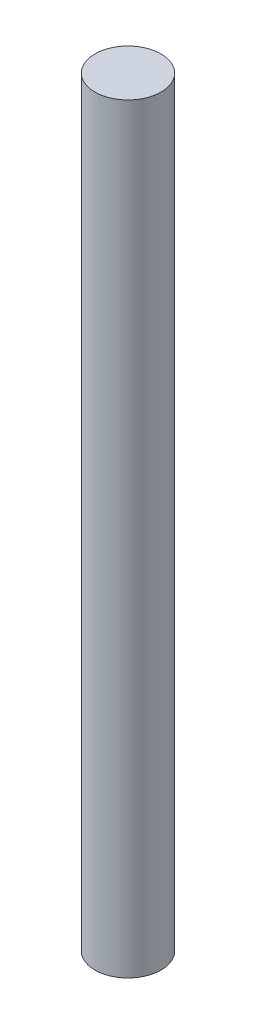
ISO-10303-21;
HEADER;
FILE_DESCRIPTION(('STEP AP214'),'2;1');
FILE_NAME('part.step','',(''),(''),'','','');
FILE_SCHEMA(('AUTOMOTIVE_DESIGN { 1 0 10303 214 1 1 1 1 }'));
ENDSEC;
DATA;
#1=APPLICATION_CONTEXT('core data for automotive mechanical design processes');
#2=APPLICATION_PROTOCOL_DEFINITION('international standard','automotive_design',2000,#1);
#3=PRODUCT_CONTEXT('',#1,'mechanical');
#4=PRODUCT('Part','Part','',(#3));
#5=PRODUCT_RELATED_PRODUCT_CATEGORY('part','',(#4));
#6=PRODUCT_DEFINITION_FORMATION('','',#4);
#7=PRODUCT_DEFINITION_CONTEXT('part definition',#1,'design');
#8=PRODUCT_DEFINITION('design','',#6,#7);
#9=PRODUCT_DEFINITION_SHAPE('','',#8);
#10=(LENGTH_UNIT() NAMED_UNIT(*) SI_UNIT(.MILLI.,.METRE.));
#11=(NAMED_UNIT(*) PLANE_ANGLE_UNIT() SI_UNIT($,.RADIAN.));
#12=(NAMED_UNIT(*) SI_UNIT($,.STERADIAN.) SOLID_ANGLE_UNIT());
#13=UNCERTAINTY_MEASURE_WITH_UNIT(LENGTH_MEASURE(1.E-05),#10,'distance_accuracy_value','');
#14=(GEOMETRIC_REPRESENTATION_CONTEXT(3) GLOBAL_UNCERTAINTY_ASSIGNED_CONTEXT((#13)) GLOBAL_UNIT_ASSIGNED_CONTEXT((#10,
#11,#12)) REPRESENTATION_CONTEXT('',''));
#15=CARTESIAN_POINT('',(0.,0.,0.));
#16=DIRECTION('',(0.,0.,1.));
#17=DIRECTION('',(1.,0.,0.));
#18=AXIS2_PLACEMENT_3D('',#15,#16,#17);
#19=CARTESIAN_POINT('',(37.7476914478386,-76.7316967124509,24.9730881922549));
#20=DIRECTION('',(0.,-1.,0.));
#21=DIRECTION('',(0.,0.,-1.));
#22=AXIS2_PLACEMENT_3D('',#19,#20,#21);
#23=PLANE('',#22);
#24=CARTESIAN_POINT('',(37.7476914478386,-76.7316967124509,24.9730881922549));
#25=DIRECTION('',(0.,-1.,0.));
#26=DIRECTION('',(0.,0.,-1.));
#27=AXIS2_PLACEMENT_3D('',#24,#25,#26);
#28=CIRCLE('',#27,2.);
#29=CARTESIAN_POINT('',(37.7476914478386,-76.7316967124509,26.9730881922549));
#30=VERTEX_POINT('',#29);
#31=EDGE_CURVE('E40',#30,#30,#28,.T.);
#32=ORIENTED_EDGE('',*,*,#31,.F.);
#33=EDGE_LOOP('',(#32));
#34=FACE_BOUND('',#33,.T.);
#35=ADVANCED_FACE('F33',(#34),#23,.F.);
#36=CARTESIAN_POINT('',(37.7476914478386,-128.388550961943,24.9730881922549));
#37=DIRECTION('',(0.,1.,0.));
#38=DIRECTION('',(0.,0.,1.));
#39=AXIS2_PLACEMENT_3D('',#36,#37,#38);
#40=CYLINDRICAL_SURFACE('',#39,2.);
#41=CARTESIAN_POINT('',(37.7476914478386,-122.731696712451,24.9730881922549));
#42=DIRECTION('',(0.,1.,0.));
#43=DIRECTION('',(0.,0.,1.));
#44=AXIS2_PLACEMENT_3D('',#41,#42,#43);
#45=CIRCLE('',#44,2.);
#46=CARTESIAN_POINT('',(37.7476914478386,-122.731696712451,26.9730881922549));
#47=VERTEX_POINT('',#46);
#48=EDGE_CURVE('E10',#47,#47,#45,.T.);
#49=CARTESIAN_POINT('',(37.7476914478386,-122.731696712451,26.9730881922549));
#50=CARTESIAN_POINT('',(37.7476914478386,-122.252530045784,26.9730881922549));
#51=CARTESIAN_POINT('',(37.7476914478386,-121.773363379118,26.9730881922549));
#52=CARTESIAN_POINT('',(37.7476914478386,-120.815030045784,26.9730881922549));
#53=CARTESIAN_POINT('',(37.7476914478386,-120.335863379118,26.9730881922549));
#54=CARTESIAN_POINT('',(37.7476914478386,-119.377530045784,26.9730881922549));
#55=CARTESIAN_POINT('',(37.7476914478386,-118.898363379118,26.9730881922549));
#56=CARTESIAN_POINT('',(37.7476914478386,-117.940030045784,26.9730881922549));
#57=CARTESIAN_POINT('',(37.7476914478386,-117.460863379118,26.9730881922549));
#58=CARTESIAN_POINT('',(37.7476914478386,-116.502530045784,26.9730881922549));
#59=CARTESIAN_POINT('',(37.7476914478386,-116.023363379118,26.9730881922549));
#60=CARTESIAN_POINT('',(37.7476914478386,-115.065030045784,26.9730881922549));
#61=CARTESIAN_POINT('',(37.7476914478386,-114.585863379118,26.9730881922549));
#62=CARTESIAN_POINT('',(37.7476914478386,-113.627530045784,26.9730881922549));
#63=CARTESIAN_POINT('',(37.7476914478386,-113.148363379118,26.9730881922549));
#64=CARTESIAN_POINT('',(37.7476914478386,-112.190030045784,26.9730881922549));
#65=CARTESIAN_POINT('',(37.7476914478386,-111.710863379118,26.9730881922549));
#66=CARTESIAN_POINT('',(37.7476914478386,-110.752530045784,26.9730881922549));
#67=CARTESIAN_POINT('',(37.7476914478386,-110.273363379118,26.9730881922549));
#68=CARTESIAN_POINT('',(37.7476914478386,-109.315030045784,26.9730881922549));
#69=CARTESIAN_POINT('',(37.7476914478386,-108.835863379118,26.9730881922549));
#70=CARTESIAN_POINT('',(37.7476914478386,-107.877530045784,26.9730881922549));
#71=CARTESIAN_POINT('',(37.7476914478386,-107.398363379118,26.9730881922549));
#72=CARTESIAN_POINT('',(37.7476914478386,-106.440030045784,26.9730881922549));
#73=CARTESIAN_POINT('',(37.7476914478386,-105.960863379118,26.9730881922549));
#74=CARTESIAN_POINT('',(37.7476914478386,-105.002530045784,26.9730881922549));
#75=CARTESIAN_POINT('',(37.7476914478386,-104.523363379118,26.9730881922549));
#76=CARTESIAN_POINT('',(37.7476914478386,-103.565030045784,26.9730881922549));
#77=CARTESIAN_POINT('',(37.7476914478386,-103.085863379118,26.9730881922549));
#78=CARTESIAN_POINT('',(37.7476914478386,-102.127530045784,26.9730881922549));
#79=CARTESIAN_POINT('',(37.7476914478386,-101.648363379118,26.9730881922549));
#80=CARTESIAN_POINT('',(37.7476914478386,-100.690030045784,26.9730881922549));
#81=CARTESIAN_POINT('',(37.7476914478386,-100.210863379118,26.9730881922549));
#82=CARTESIAN_POINT('',(37.7476914478386,-99.2525300457842,26.9730881922549));
#83=CARTESIAN_POINT('',(37.7476914478386,-98.7733633791176,26.9730881922549));
#84=CARTESIAN_POINT('',(37.7476914478386,-97.8150300457843,26.9730881922549));
#85=CARTESIAN_POINT('',(37.7476914478386,-97.3358633791176,26.9730881922549));
#86=CARTESIAN_POINT('',(37.7476914478386,-96.3775300457843,26.9730881922549));
#87=CARTESIAN_POINT('',(37.7476914478386,-95.8983633791176,26.9730881922549));
#88=CARTESIAN_POINT('',(37.7476914478386,-94.9400300457842,26.9730881922549));
#89=CARTESIAN_POINT('',(37.7476914478386,-94.4608633791176,26.9730881922549));
#90=CARTESIAN_POINT('',(37.7476914478386,-93.5025300457843,26.9730881922549));
#91=CARTESIAN_POINT('',(37.7476914478386,-93.0233633791176,26.9730881922549));
#92=CARTESIAN_POINT('',(37.7476914478386,-92.0650300457843,26.9730881922549));
#93=CARTESIAN_POINT('',(37.7476914478386,-91.5858633791176,26.9730881922549));
#94=CARTESIAN_POINT('',(37.7476914478386,-90.6275300457843,26.9730881922549));
#95=CARTESIAN_POINT('',(37.7476914478386,-90.1483633791176,26.9730881922549));
#96=CARTESIAN_POINT('',(37.7476914478386,-89.1900300457842,26.9730881922549));
#97=CARTESIAN_POINT('',(37.7476914478386,-88.7108633791176,26.9730881922549));
#98=CARTESIAN_POINT('',(37.7476914478386,-87.7525300457842,26.9730881922549));
#99=CARTESIAN_POINT('',(37.7476914478386,-87.2733633791176,26.9730881922549));
#100=CARTESIAN_POINT('',(37.7476914478386,-86.3150300457843,26.9730881922549));
#101=CARTESIAN_POINT('',(37.7476914478386,-85.8358633791176,26.9730881922549));
#102=CARTESIAN_POINT('',(37.7476914478386,-84.8775300457842,26.9730881922549));
#103=CARTESIAN_POINT('',(37.7476914478386,-84.3983633791176,26.9730881922549));
#104=CARTESIAN_POINT('',(37.7476914478386,-83.4400300457842,26.9730881922549));
#105=CARTESIAN_POINT('',(37.7476914478386,-82.9608633791176,26.9730881922549));
#106=CARTESIAN_POINT('',(37.7476914478386,-82.0025300457842,26.9730881922549));
#107=CARTESIAN_POINT('',(37.7476914478386,-81.5233633791176,26.9730881922549));
#108=CARTESIAN_POINT('',(37.7476914478386,-80.5650300457842,26.9730881922549));
#109=CARTESIAN_POINT('',(37.7476914478386,-80.0858633791176,26.9730881922549));
#110=CARTESIAN_POINT('',(37.7476914478386,-79.1275300457842,26.9730881922549));
#111=CARTESIAN_POINT('',(37.7476914478386,-78.6483633791176,26.9730881922549));
#112=CARTESIAN_POINT('',(37.7476914478386,-77.6900300457842,26.9730881922549));
#113=CARTESIAN_POINT('',(37.7476914478386,-77.2108633791176,26.9730881922549));
#114=CARTESIAN_POINT('',(37.7476914478386,-76.7316967124509,26.9730881922549));
#115=B_SPLINE_CURVE_WITH_KNOTS('',3,(#49,#50,#51,#52,#53,#54,#55,#56,#57,#58,#59,#60,#61,#62,
#63,#64,#65,#66,#67,#68,#69,#70,#71,#72,#73,#74,#75,#76,#77,#78,#79,#80,#81,#82,#83,#84,#85,#86,
#87,#88,#89,#90,#91,#92,#93,#94,#95,#96,#97,#98,#99,#100,#101,#102,#103,#104,#105,#106,#107,
#108,#109,#110,#111,#112,#113,#114),.UNSPECIFIED.,.F.,.F.,(4,2,2,2,2,2,2,2,2,2,2,2,2,2,2,2,2,2,
2,2,2,2,2,2,2,2,2,2,2,2,2,2,4),(0.,1.43750000000001,2.875,4.31250000000001,5.75000000000001,
7.1875,8.62500000000001,10.0625,11.5,12.9375,14.375,15.8125,17.25,18.6875,20.125,21.5625,23.,
24.4375,25.875,27.3125,28.75,30.1875,31.625,33.0625,34.5,35.9375,37.375,38.8125,40.25,41.6875,
43.125,44.5625,46.),.UNSPECIFIED.);
#116=EDGE_CURVE('BSEAM35',#47,#30,#115,.T.);
#117=ORIENTED_EDGE('',*,*,#48,.T.);
#118=ORIENTED_EDGE('',*,*,#31,.T.);
#119=ORIENTED_EDGE('',*,*,#116,.T.);
#120=ORIENTED_EDGE('',*,*,#116,.F.);
#121=EDGE_LOOP('',(#117,#119,#118,#120));
#122=FACE_BOUND('',#121,.T.);
#123=ADVANCED_FACE('F35',(#122),#40,.T.);
#124=CARTESIAN_POINT('',(177.747691447839,-122.731696712451,24.9730881922548));
#125=DIRECTION('',(0.,1.,0.));
#126=DIRECTION('',(0.,0.,1.));
#127=AXIS2_PLACEMENT_3D('',#124,#125,#126);
#128=PLANE('',#127);
#129=ORIENTED_EDGE('',*,*,#48,.F.);
#130=EDGE_LOOP('',(#129));
#131=FACE_BOUND('',#130,.T.);
#132=ADVANCED_FACE('F51',(#131),#128,.F.);
#133=CLOSED_SHELL('',(#35,#123,#132));
#134=MANIFOLD_SOLID_BREP('B2',#133);
#135=ADVANCED_BREP_SHAPE_REPRESENTATION('',(#18,#134),#14);
#136=SHAPE_DEFINITION_REPRESENTATION(#9,#135);
ENDSEC;
END-ISO-10303-21;
